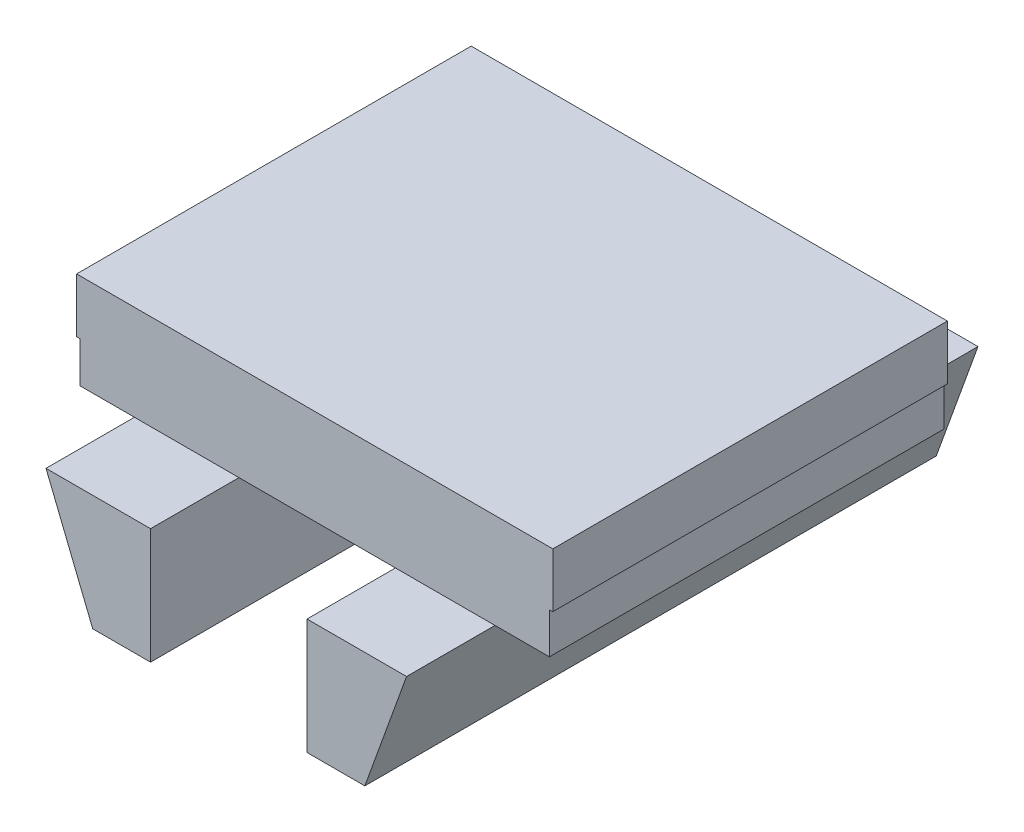
ISO-10303-21;
HEADER;
FILE_DESCRIPTION(('STEP AP214'),'2;1');
FILE_NAME('part.step','',(''),(''),'','','');
FILE_SCHEMA(('AUTOMOTIVE_DESIGN { 1 0 10303 214 1 1 1 1 }'));
ENDSEC;
DATA;
#1=APPLICATION_CONTEXT('core data for automotive mechanical design processes');
#2=APPLICATION_PROTOCOL_DEFINITION('international standard','automotive_design',2000,#1);
#3=PRODUCT_CONTEXT('',#1,'mechanical');
#4=PRODUCT('Part','Part','',(#3));
#5=PRODUCT_RELATED_PRODUCT_CATEGORY('part','',(#4));
#6=PRODUCT_DEFINITION_FORMATION('','',#4);
#7=PRODUCT_DEFINITION_CONTEXT('part definition',#1,'design');
#8=PRODUCT_DEFINITION('design','',#6,#7);
#9=PRODUCT_DEFINITION_SHAPE('','',#8);
#10=(LENGTH_UNIT() NAMED_UNIT(*) SI_UNIT(.MILLI.,.METRE.));
#11=(NAMED_UNIT(*) PLANE_ANGLE_UNIT() SI_UNIT($,.RADIAN.));
#12=(NAMED_UNIT(*) SI_UNIT($,.STERADIAN.) SOLID_ANGLE_UNIT());
#13=UNCERTAINTY_MEASURE_WITH_UNIT(LENGTH_MEASURE(1.E-05),#10,'distance_accuracy_value','');
#14=(GEOMETRIC_REPRESENTATION_CONTEXT(3) GLOBAL_UNCERTAINTY_ASSIGNED_CONTEXT((#13)) GLOBAL_UNIT_ASSIGNED_CONTEXT((#10,
#11,#12)) REPRESENTATION_CONTEXT('',''));
#15=CARTESIAN_POINT('',(0.,0.,0.));
#16=DIRECTION('',(0.,0.,1.));
#17=DIRECTION('',(1.,0.,0.));
#18=AXIS2_PLACEMENT_3D('',#15,#16,#17);
#19=CARTESIAN_POINT('',(-9.64285714285713,-4.85714285714286,-13.));
#20=DIRECTION('',(0.,1.,0.));
#21=DIRECTION('',(0.,0.,1.));
#22=AXIS2_PLACEMENT_3D('',#19,#20,#21);
#23=PLANE('',#22);
#24=DIRECTION('',(0.,0.,1.));
#25=VECTOR('',#24,1.);
#26=CARTESIAN_POINT('',(5.72394297103002,-4.85714285714286,-13.001));
#27=LINE('',#26,#25);
#28=CARTESIAN_POINT('',(5.72394297103002,-4.85714285714286,-13.));
#29=VERTEX_POINT('',#28);
#30=CARTESIAN_POINT('',(5.72394297103002,-4.85714285714286,0.));
#31=VERTEX_POINT('',#30);
#32=EDGE_CURVE('E193',#29,#31,#27,.T.);
#33=ORIENTED_EDGE('',*,*,#32,.F.);
#34=DIRECTION('',(-1.,0.,0.));
#35=VECTOR('',#34,1.);
#36=CARTESIAN_POINT('',(-9.64285714285713,-4.85714285714286,-13.));
#37=LINE('',#36,#35);
#38=CARTESIAN_POINT('',(-9.64285714285713,-4.85714285714286,-13.));
#39=VERTEX_POINT('',#38);
#40=EDGE_CURVE('E202',#29,#39,#37,.T.);
#41=ORIENTED_EDGE('',*,*,#40,.T.);
#42=DIRECTION('',(0.,0.,1.));
#43=VECTOR('',#42,1.);
#44=CARTESIAN_POINT('',(-9.64285714285713,-4.85714285714286,-13.));
#45=LINE('',#44,#43);
#46=CARTESIAN_POINT('',(-9.64285714285713,-4.85714285714286,0.));
#47=VERTEX_POINT('',#46);
#48=EDGE_CURVE('E50',#39,#47,#45,.T.);
#49=ORIENTED_EDGE('',*,*,#48,.T.);
#50=DIRECTION('',(1.,0.,0.));
#51=VECTOR('',#50,1.);
#52=CARTESIAN_POINT('',(-17.6428571428571,-4.85714285714286,0.));
#53=LINE('',#52,#51);
#54=EDGE_CURVE('E238',#47,#31,#53,.T.);
#55=ORIENTED_EDGE('',*,*,#54,.T.);
#56=EDGE_LOOP('',(#33,#41,#49,#55));
#57=FACE_BOUND('',#56,.T.);
#58=ADVANCED_FACE('F39',(#57),#23,.T.);
#59=CARTESIAN_POINT('',(5.72394297103002,-4.85714285714286,58.));
#60=VERTEX_POINT('',#59);
#61=CARTESIAN_POINT('',(5.72394297103002,-4.85714285714286,71.));
#62=VERTEX_POINT('',#61);
#63=EDGE_CURVE('E336',#60,#62,#27,.T.);
#64=ORIENTED_EDGE('',*,*,#63,.F.);
#65=DIRECTION('',(-1.,0.,0.));
#66=VECTOR('',#65,1.);
#67=CARTESIAN_POINT('',(-17.6428571428571,-4.85714285714286,58.));
#68=LINE('',#67,#66);
#69=CARTESIAN_POINT('',(-9.64285714285713,-4.85714285714286,58.));
#70=VERTEX_POINT('',#69);
#71=EDGE_CURVE('E66',#60,#70,#68,.T.);
#72=ORIENTED_EDGE('',*,*,#71,.T.);
#73=CARTESIAN_POINT('',(-9.64285714285713,-4.85714285714286,71.));
#74=VERTEX_POINT('',#73);
#75=EDGE_CURVE('E51',#70,#74,#45,.T.);
#76=ORIENTED_EDGE('',*,*,#75,.T.);
#77=DIRECTION('',(-1.,0.,0.));
#78=VECTOR('',#77,1.);
#79=CARTESIAN_POINT('',(-9.64285714285713,-4.85714285714286,71.));
#80=LINE('',#79,#78);
#81=EDGE_CURVE('E314',#62,#74,#80,.T.);
#82=ORIENTED_EDGE('',*,*,#81,.F.);
#83=EDGE_LOOP('',(#64,#72,#76,#82));
#84=FACE_BOUND('',#83,.T.);
#85=ADVANCED_FACE('F379',(#84),#23,.T.);
#86=CARTESIAN_POINT('',(37.22394297103,-21.8530695440626,-13.));
#87=DIRECTION('',(0.,-1.,0.));
#88=DIRECTION('',(0.,0.,-1.));
#89=AXIS2_PLACEMENT_3D('',#86,#87,#88);
#90=PLANE('',#89);
#91=DIRECTION('',(0.,0.,1.));
#92=VECTOR('',#91,1.);
#93=CARTESIAN_POINT('',(5.72394297103002,-21.8530695440626,-13.001));
#94=LINE('',#93,#92);
#95=CARTESIAN_POINT('',(5.72394297103002,-21.8530695440626,-13.));
#96=VERTEX_POINT('',#95);
#97=CARTESIAN_POINT('',(5.72394297103002,-21.8530695440626,71.));
#98=VERTEX_POINT('',#97);
#99=EDGE_CURVE('E180',#96,#98,#94,.T.);
#100=ORIENTED_EDGE('',*,*,#99,.T.);
#101=DIRECTION('',(1.,0.,0.));
#102=VECTOR('',#101,1.);
#103=CARTESIAN_POINT('',(37.22394297103,-21.8530695440626,71.));
#104=LINE('',#103,#102);
#105=CARTESIAN_POINT('',(-2.77605702896998,-21.8530695440626,71.));
#106=VERTEX_POINT('',#105);
#107=EDGE_CURVE('E315',#106,#98,#104,.T.);
#108=ORIENTED_EDGE('',*,*,#107,.F.);
#109=DIRECTION('',(0.,0.,1.));
#110=VECTOR('',#109,1.);
#111=CARTESIAN_POINT('',(-2.77605702896998,-21.8530695440626,-13.));
#112=LINE('',#111,#110);
#113=CARTESIAN_POINT('',(-2.77605702896998,-21.8530695440626,-13.));
#114=VERTEX_POINT('',#113);
#115=EDGE_CURVE('E206',#114,#106,#112,.T.);
#116=ORIENTED_EDGE('',*,*,#115,.F.);
#117=DIRECTION('',(1.,0.,0.));
#118=VECTOR('',#117,1.);
#119=CARTESIAN_POINT('',(37.22394297103,-21.8530695440626,-13.));
#120=LINE('',#119,#118);
#121=EDGE_CURVE('E200',#114,#96,#120,.T.);
#122=ORIENTED_EDGE('',*,*,#121,.T.);
#123=EDGE_LOOP('',(#100,#108,#116,#122));
#124=FACE_BOUND('',#123,.T.);
#125=ADVANCED_FACE('F205',(#124),#90,.T.);
#126=CARTESIAN_POINT('',(0.,0.,-13.));
#127=DIRECTION('',(0.,0.,-1.));
#128=DIRECTION('',(-1.,0.,0.));
#129=AXIS2_PLACEMENT_3D('',#126,#127,#128);
#130=PLANE('',#129);
#131=DIRECTION('',(0.,-1.,0.));
#132=VECTOR('',#131,1.);
#133=CARTESIAN_POINT('',(5.72394297103002,-21.8530695440626,-13.));
#134=LINE('',#133,#132);
#135=EDGE_CURVE('E184',#29,#96,#134,.T.);
#136=ORIENTED_EDGE('',*,*,#135,.T.);
#137=ORIENTED_EDGE('',*,*,#121,.F.);
#138=DIRECTION('',(0.37460659341591,-0.927183854566788,0.));
#139=VECTOR('',#138,1.);
#140=CARTESIAN_POINT('',(-2.77605702896998,-21.8530695440626,-13.));
#141=LINE('',#140,#139);
#142=EDGE_CURVE('E212',#39,#114,#141,.T.);
#143=ORIENTED_EDGE('',*,*,#142,.F.);
#144=ORIENTED_EDGE('',*,*,#40,.F.);
#145=EDGE_LOOP('',(#136,#137,#143,#144));
#146=FACE_BOUND('',#145,.T.);
#147=ADVANCED_FACE('F198',(#146),#130,.T.);
#148=CARTESIAN_POINT('',(0.,0.,71.));
#149=DIRECTION('',(0.,0.,-1.));
#150=DIRECTION('',(-1.,0.,0.));
#151=AXIS2_PLACEMENT_3D('',#148,#149,#150);
#152=PLANE('',#151);
#153=ORIENTED_EDGE('',*,*,#107,.T.);
#154=DIRECTION('',(0.,-1.,0.));
#155=VECTOR('',#154,1.);
#156=CARTESIAN_POINT('',(5.72394297103002,-21.8530695440626,71.));
#157=LINE('',#156,#155);
#158=EDGE_CURVE('E187',#62,#98,#157,.T.);
#159=ORIENTED_EDGE('',*,*,#158,.F.);
#160=ORIENTED_EDGE('',*,*,#81,.T.);
#161=DIRECTION('',(0.37460659341591,-0.927183854566788,0.));
#162=VECTOR('',#161,1.);
#163=CARTESIAN_POINT('',(-2.77605702896998,-21.8530695440626,71.));
#164=LINE('',#163,#162);
#165=EDGE_CURVE('E322',#74,#106,#164,.T.);
#166=ORIENTED_EDGE('',*,*,#165,.T.);
#167=EDGE_LOOP('',(#153,#159,#160,#166));
#168=FACE_BOUND('',#167,.T.);
#169=ADVANCED_FACE('F381',(#168),#152,.F.);
#170=CARTESIAN_POINT('',(0.,-4.85714285714286,0.));
#171=DIRECTION('',(0.,-1.,0.));
#172=DIRECTION('',(1.,0.,0.));
#173=AXIS2_PLACEMENT_3D('',#170,#171,#172);
#174=PLANE('',#173);
#175=CARTESIAN_POINT('',(-17.6428571428571,-4.85714285714286,0.));
#176=VERTEX_POINT('',#175);
#177=EDGE_CURVE('E234',#176,#47,#53,.T.);
#178=ORIENTED_EDGE('',*,*,#177,.T.);
#179=EDGE_CURVE('E11',#47,#70,#45,.T.);
#180=ORIENTED_EDGE('',*,*,#179,.T.);
#181=CARTESIAN_POINT('',(-17.6428571428571,-4.85714285714286,58.));
#182=VERTEX_POINT('',#181);
#183=EDGE_CURVE('E241',#70,#182,#68,.T.);
#184=ORIENTED_EDGE('',*,*,#183,.T.);
#185=DIRECTION('',(0.,0.,-1.));
#186=VECTOR('',#185,1.);
#187=CARTESIAN_POINT('',(-17.6428571428571,-4.85714285714286,58.));
#188=LINE('',#187,#186);
#189=EDGE_CURVE('E229',#182,#176,#188,.T.);
#190=ORIENTED_EDGE('',*,*,#189,.T.);
#191=EDGE_LOOP('',(#178,#180,#184,#190));
#192=FACE_BOUND('',#191,.T.);
#193=ADVANCED_FACE('F370',(#192),#174,.T.);
#194=CARTESIAN_POINT('',(-18.1428571428571,1.14285714285714,58.));
#195=DIRECTION('',(0.,1.,0.));
#196=DIRECTION('',(-1.,0.,0.));
#197=AXIS2_PLACEMENT_3D('',#194,#195,#196);
#198=PLANE('',#197);
#199=DIRECTION('',(0.,0.,-1.));
#200=VECTOR('',#199,1.);
#201=CARTESIAN_POINT('',(-17.6428571428571,1.14285714285714,58.));
#202=LINE('',#201,#200);
#203=CARTESIAN_POINT('',(-17.6428571428571,1.14285714285714,58.));
#204=VERTEX_POINT('',#203);
#205=CARTESIAN_POINT('',(-17.6428571428571,1.14285714285714,0.));
#206=VERTEX_POINT('',#205);
#207=EDGE_CURVE('E220',#204,#206,#202,.T.);
#208=ORIENTED_EDGE('',*,*,#207,.F.);
#209=DIRECTION('',(1.,0.,0.));
#210=VECTOR('',#209,1.);
#211=CARTESIAN_POINT('',(-18.1428571428571,1.14285714285714,58.));
#212=LINE('',#211,#210);
#213=CARTESIAN_POINT('',(-18.1428571428571,1.14285714285714,58.));
#214=VERTEX_POINT('',#213);
#215=EDGE_CURVE('E267',#214,#204,#212,.T.);
#216=ORIENTED_EDGE('',*,*,#215,.F.);
#217=DIRECTION('',(0.,0.,-1.));
#218=VECTOR('',#217,1.);
#219=CARTESIAN_POINT('',(-18.1428571428571,1.14285714285714,58.));
#220=LINE('',#219,#218);
#221=CARTESIAN_POINT('',(-18.1428571428571,1.14285714285714,0.));
#222=VERTEX_POINT('',#221);
#223=EDGE_CURVE('E43',#214,#222,#220,.T.);
#224=ORIENTED_EDGE('',*,*,#223,.T.);
#225=DIRECTION('',(1.,0.,0.));
#226=VECTOR('',#225,1.);
#227=CARTESIAN_POINT('',(-18.1428571428571,1.14285714285714,0.));
#228=LINE('',#227,#226);
#229=EDGE_CURVE('E278',#222,#206,#228,.T.);
#230=ORIENTED_EDGE('',*,*,#229,.T.);
#231=EDGE_LOOP('',(#208,#216,#224,#230));
#232=FACE_BOUND('',#231,.T.);
#233=ADVANCED_FACE('F388',(#232),#198,.F.);
#234=DIRECTION('',(0.,0.,1.));
#235=VECTOR('',#234,1.);
#236=CARTESIAN_POINT('',(51.3571428571429,1.14285714285714,58.));
#237=LINE('',#236,#235);
#238=CARTESIAN_POINT('',(51.3571428571429,1.14285714285714,0.));
#239=VERTEX_POINT('',#238);
#240=CARTESIAN_POINT('',(51.3571428571429,1.14285714285714,58.));
#241=VERTEX_POINT('',#240);
#242=EDGE_CURVE('E233',#239,#241,#237,.T.);
#243=ORIENTED_EDGE('',*,*,#242,.F.);
#244=CARTESIAN_POINT('',(51.8571428571429,1.14285714285714,0.));
#245=VERTEX_POINT('',#244);
#246=EDGE_CURVE('E277',#239,#245,#228,.T.);
#247=ORIENTED_EDGE('',*,*,#246,.T.);
#248=DIRECTION('',(0.,0.,-1.));
#249=VECTOR('',#248,1.);
#250=CARTESIAN_POINT('',(51.8571428571429,1.14285714285714,58.));
#251=LINE('',#250,#249);
#252=CARTESIAN_POINT('',(51.8571428571429,1.14285714285714,58.));
#253=VERTEX_POINT('',#252);
#254=EDGE_CURVE('E287',#253,#245,#251,.T.);
#255=ORIENTED_EDGE('',*,*,#254,.F.);
#256=EDGE_CURVE('E265',#241,#253,#212,.T.);
#257=ORIENTED_EDGE('',*,*,#256,.F.);
#258=EDGE_LOOP('',(#243,#247,#255,#257));
#259=FACE_BOUND('',#258,.T.);
#260=ADVANCED_FACE('F435',(#259),#198,.F.);
#261=CARTESIAN_POINT('',(-18.1428571428571,9.14285714285714,58.));
#262=DIRECTION('',(1.,0.,0.));
#263=DIRECTION('',(0.,0.,-1.));
#264=AXIS2_PLACEMENT_3D('',#261,#262,#263);
#265=PLANE('',#264);
#266=DIRECTION('',(0.,-1.,0.));
#267=VECTOR('',#266,1.);
#268=CARTESIAN_POINT('',(-18.1428571428571,9.14285714285714,0.));
#269=LINE('',#268,#267);
#270=CARTESIAN_POINT('',(-18.1428571428571,9.14285714285714,0.));
#271=VERTEX_POINT('',#270);
#272=EDGE_CURVE('E261',#271,#222,#269,.T.);
#273=ORIENTED_EDGE('',*,*,#272,.T.);
#274=ORIENTED_EDGE('',*,*,#223,.F.);
#275=DIRECTION('',(0.,-1.,0.));
#276=VECTOR('',#275,1.);
#277=CARTESIAN_POINT('',(-18.1428571428571,9.14285714285714,58.));
#278=LINE('',#277,#276);
#279=CARTESIAN_POINT('',(-18.1428571428571,9.14285714285714,58.));
#280=VERTEX_POINT('',#279);
#281=EDGE_CURVE('E262',#280,#214,#278,.T.);
#282=ORIENTED_EDGE('',*,*,#281,.F.);
#283=DIRECTION('',(0.,0.,-1.));
#284=VECTOR('',#283,1.);
#285=CARTESIAN_POINT('',(-18.1428571428571,9.14285714285714,58.));
#286=LINE('',#285,#284);
#287=EDGE_CURVE('E274',#280,#271,#286,.T.);
#288=ORIENTED_EDGE('',*,*,#287,.T.);
#289=EDGE_LOOP('',(#273,#274,#282,#288));
#290=FACE_BOUND('',#289,.T.);
#291=ADVANCED_FACE('F41',(#290),#265,.F.);
#292=CARTESIAN_POINT('',(51.8571428571429,9.14285714285714,58.));
#293=DIRECTION('',(-1.,0.,0.));
#294=DIRECTION('',(0.,0.,1.));
#295=AXIS2_PLACEMENT_3D('',#292,#293,#294);
#296=PLANE('',#295);
#297=DIRECTION('',(0.,1.,0.));
#298=VECTOR('',#297,1.);
#299=CARTESIAN_POINT('',(51.8571428571429,9.14285714285714,0.));
#300=LINE('',#299,#298);
#301=CARTESIAN_POINT('',(51.8571428571429,9.14285714285714,0.));
#302=VERTEX_POINT('',#301);
#303=EDGE_CURVE('E280',#245,#302,#300,.T.);
#304=ORIENTED_EDGE('',*,*,#303,.T.);
#305=DIRECTION('',(0.,0.,-1.));
#306=VECTOR('',#305,1.);
#307=CARTESIAN_POINT('',(51.8571428571429,9.14285714285714,58.));
#308=LINE('',#307,#306);
#309=CARTESIAN_POINT('',(51.8571428571429,9.14285714285714,58.));
#310=VERTEX_POINT('',#309);
#311=EDGE_CURVE('E285',#310,#302,#308,.T.);
#312=ORIENTED_EDGE('',*,*,#311,.F.);
#313=DIRECTION('',(0.,1.,0.));
#314=VECTOR('',#313,1.);
#315=CARTESIAN_POINT('',(51.8571428571429,9.14285714285714,58.));
#316=LINE('',#315,#314);
#317=EDGE_CURVE('E270',#253,#310,#316,.T.);
#318=ORIENTED_EDGE('',*,*,#317,.F.);
#319=ORIENTED_EDGE('',*,*,#254,.T.);
#320=EDGE_LOOP('',(#304,#312,#318,#319));
#321=FACE_BOUND('',#320,.T.);
#322=ADVANCED_FACE('F431',(#321),#296,.F.);
#323=CARTESIAN_POINT('',(-18.1428571428571,9.14285714285714,58.));
#324=DIRECTION('',(0.,-1.,0.));
#325=DIRECTION('',(0.,0.,-1.));
#326=AXIS2_PLACEMENT_3D('',#323,#324,#325);
#327=PLANE('',#326);
#328=DIRECTION('',(-1.,0.,0.));
#329=VECTOR('',#328,1.);
#330=CARTESIAN_POINT('',(-18.1428571428571,9.14285714285714,0.));
#331=LINE('',#330,#329);
#332=EDGE_CURVE('E266',#302,#271,#331,.T.);
#333=ORIENTED_EDGE('',*,*,#332,.T.);
#334=ORIENTED_EDGE('',*,*,#287,.F.);
#335=DIRECTION('',(-1.,0.,0.));
#336=VECTOR('',#335,1.);
#337=CARTESIAN_POINT('',(-18.1428571428571,9.14285714285714,58.));
#338=LINE('',#337,#336);
#339=EDGE_CURVE('E272',#310,#280,#338,.T.);
#340=ORIENTED_EDGE('',*,*,#339,.F.);
#341=ORIENTED_EDGE('',*,*,#311,.T.);
#342=EDGE_LOOP('',(#333,#334,#340,#341));
#343=FACE_BOUND('',#342,.T.);
#344=ADVANCED_FACE('F425',(#343),#327,.F.);
#345=CARTESIAN_POINT('',(0.,0.,58.));
#346=DIRECTION('',(0.,0.,1.));
#347=DIRECTION('',(1.,0.,0.));
#348=AXIS2_PLACEMENT_3D('',#345,#346,#347);
#349=PLANE('',#348);
#350=ORIENTED_EDGE('',*,*,#281,.T.);
#351=ORIENTED_EDGE('',*,*,#215,.T.);
#352=DIRECTION('',(0.,1.,0.));
#353=VECTOR('',#352,1.);
#354=CARTESIAN_POINT('',(-17.6428571428571,-4.85714285714286,58.));
#355=LINE('',#354,#353);
#356=EDGE_CURVE('E244',#182,#204,#355,.T.);
#357=ORIENTED_EDGE('',*,*,#356,.F.);
#358=ORIENTED_EDGE('',*,*,#183,.F.);
#359=ORIENTED_EDGE('',*,*,#71,.F.);
#360=DIRECTION('',(-1.,0.,0.));
#361=VECTOR('',#360,1.);
#362=CARTESIAN_POINT('',(0.,-4.85714285714286,58.));
#363=LINE('',#362,#361);
#364=CARTESIAN_POINT('',(28.72394297103,-4.85714285714286,58.));
#365=VERTEX_POINT('',#364);
#366=EDGE_CURVE('E325',#365,#60,#363,.T.);
#367=ORIENTED_EDGE('',*,*,#366,.F.);
#368=CARTESIAN_POINT('',(43.3571428571429,-4.85714285714286,58.));
#369=VERTEX_POINT('',#368);
#370=EDGE_CURVE('E245',#369,#365,#68,.T.);
#371=ORIENTED_EDGE('',*,*,#370,.F.);
#372=CARTESIAN_POINT('',(51.3571428571429,-4.85714285714286,58.));
#373=VERTEX_POINT('',#372);
#374=EDGE_CURVE('E242',#373,#369,#68,.T.);
#375=ORIENTED_EDGE('',*,*,#374,.F.);
#376=DIRECTION('',(0.,1.,0.));
#377=VECTOR('',#376,1.);
#378=CARTESIAN_POINT('',(51.3571428571429,-4.85714285714286,58.));
#379=LINE('',#378,#377);
#380=EDGE_CURVE('E252',#373,#241,#379,.T.);
#381=ORIENTED_EDGE('',*,*,#380,.T.);
#382=ORIENTED_EDGE('',*,*,#256,.T.);
#383=ORIENTED_EDGE('',*,*,#317,.T.);
#384=ORIENTED_EDGE('',*,*,#339,.T.);
#385=EDGE_LOOP('',(#350,#351,#357,#358,#359,#367,#371,#375,#381,#382,#383,#384));
#386=FACE_BOUND('',#385,.T.);
#387=ADVANCED_FACE('F422',(#386),#349,.T.);
#388=CARTESIAN_POINT('',(0.,0.,0.));
#389=DIRECTION('',(0.,0.,1.));
#390=DIRECTION('',(1.,0.,0.));
#391=AXIS2_PLACEMENT_3D('',#388,#389,#390);
#392=PLANE('',#391);
#393=ORIENTED_EDGE('',*,*,#272,.F.);
#394=ORIENTED_EDGE('',*,*,#332,.F.);
#395=ORIENTED_EDGE('',*,*,#303,.F.);
#396=ORIENTED_EDGE('',*,*,#246,.F.);
#397=DIRECTION('',(0.,1.,0.));
#398=VECTOR('',#397,1.);
#399=CARTESIAN_POINT('',(51.3571428571429,-4.85714285714286,0.));
#400=LINE('',#399,#398);
#401=CARTESIAN_POINT('',(51.3571428571429,-4.85714285714286,0.));
#402=VERTEX_POINT('',#401);
#403=EDGE_CURVE('E255',#402,#239,#400,.T.);
#404=ORIENTED_EDGE('',*,*,#403,.F.);
#405=CARTESIAN_POINT('',(43.3571428571429,-4.85714285714286,0.));
#406=VERTEX_POINT('',#405);
#407=EDGE_CURVE('E232',#406,#402,#53,.T.);
#408=ORIENTED_EDGE('',*,*,#407,.F.);
#409=CARTESIAN_POINT('',(28.72394297103,-4.85714285714286,0.));
#410=VERTEX_POINT('',#409);
#411=EDGE_CURVE('E239',#410,#406,#53,.T.);
#412=ORIENTED_EDGE('',*,*,#411,.F.);
#413=DIRECTION('',(-1.,0.,0.));
#414=VECTOR('',#413,1.);
#415=CARTESIAN_POINT('',(0.,-4.85714285714286,0.));
#416=LINE('',#415,#414);
#417=EDGE_CURVE('E327',#410,#31,#416,.T.);
#418=ORIENTED_EDGE('',*,*,#417,.T.);
#419=ORIENTED_EDGE('',*,*,#54,.F.);
#420=ORIENTED_EDGE('',*,*,#177,.F.);
#421=DIRECTION('',(0.,1.,0.));
#422=VECTOR('',#421,1.);
#423=CARTESIAN_POINT('',(-17.6428571428571,-4.85714285714286,0.));
#424=LINE('',#423,#422);
#425=EDGE_CURVE('E258',#176,#206,#424,.T.);
#426=ORIENTED_EDGE('',*,*,#425,.T.);
#427=ORIENTED_EDGE('',*,*,#229,.F.);
#428=EDGE_LOOP('',(#393,#394,#395,#396,#404,#408,#412,#418,#419,#420,#426,#427));
#429=FACE_BOUND('',#428,.T.);
#430=ADVANCED_FACE('F362',(#429),#392,.F.);
#431=CARTESIAN_POINT('',(-17.6428571428571,-4.85714285714286,58.));
#432=DIRECTION('',(1.,0.,0.));
#433=DIRECTION('',(0.,0.,-1.));
#434=AXIS2_PLACEMENT_3D('',#431,#432,#433);
#435=PLANE('',#434);
#436=ORIENTED_EDGE('',*,*,#207,.T.);
#437=ORIENTED_EDGE('',*,*,#425,.F.);
#438=ORIENTED_EDGE('',*,*,#189,.F.);
#439=ORIENTED_EDGE('',*,*,#356,.T.);
#440=EDGE_LOOP('',(#436,#437,#438,#439));
#441=FACE_BOUND('',#440,.T.);
#442=ADVANCED_FACE('F414',(#441),#435,.F.);
#443=CARTESIAN_POINT('',(51.3571428571429,-4.85714285714286,58.));
#444=DIRECTION('',(-1.,0.,0.));
#445=DIRECTION('',(0.,0.,1.));
#446=AXIS2_PLACEMENT_3D('',#443,#444,#445);
#447=PLANE('',#446);
#448=ORIENTED_EDGE('',*,*,#242,.T.);
#449=ORIENTED_EDGE('',*,*,#380,.F.);
#450=DIRECTION('',(0.,0.,1.));
#451=VECTOR('',#450,1.);
#452=CARTESIAN_POINT('',(51.3571428571429,-4.85714285714286,58.));
#453=LINE('',#452,#451);
#454=EDGE_CURVE('E237',#402,#373,#453,.T.);
#455=ORIENTED_EDGE('',*,*,#454,.F.);
#456=ORIENTED_EDGE('',*,*,#403,.T.);
#457=EDGE_LOOP('',(#448,#449,#455,#456));
#458=FACE_BOUND('',#457,.T.);
#459=ADVANCED_FACE('F410',(#458),#447,.F.);
#460=DIRECTION('',(0.,0.,1.));
#461=VECTOR('',#460,1.);
#462=CARTESIAN_POINT('',(43.3571428571429,-4.85714285714286,-13.));
#463=LINE('',#462,#461);
#464=EDGE_CURVE('E48',#406,#369,#463,.T.);
#465=ORIENTED_EDGE('',*,*,#464,.F.);
#466=ORIENTED_EDGE('',*,*,#407,.T.);
#467=ORIENTED_EDGE('',*,*,#454,.T.);
#468=ORIENTED_EDGE('',*,*,#374,.T.);
#469=EDGE_LOOP('',(#465,#466,#467,#468));
#470=FACE_BOUND('',#469,.T.);
#471=ADVANCED_FACE('F357',(#470),#174,.T.);
#472=DIRECTION('',(0.,0.,1.));
#473=VECTOR('',#472,1.);
#474=CARTESIAN_POINT('',(28.72394297103,-4.85714285714286,-13.001));
#475=LINE('',#474,#473);
#476=CARTESIAN_POINT('',(28.72394297103,-4.85714285714286,-13.));
#477=VERTEX_POINT('',#476);
#478=EDGE_CURVE('E333',#477,#410,#475,.T.);
#479=ORIENTED_EDGE('',*,*,#478,.T.);
#480=ORIENTED_EDGE('',*,*,#411,.T.);
#481=CARTESIAN_POINT('',(43.3571428571429,-4.85714285714286,-13.));
#482=VERTEX_POINT('',#481);
#483=EDGE_CURVE('E221',#482,#406,#463,.T.);
#484=ORIENTED_EDGE('',*,*,#483,.F.);
#485=EDGE_CURVE('E216',#482,#477,#37,.T.);
#486=ORIENTED_EDGE('',*,*,#485,.T.);
#487=EDGE_LOOP('',(#479,#480,#484,#486));
#488=FACE_BOUND('',#487,.T.);
#489=ADVANCED_FACE('F352',(#488),#23,.T.);
#490=CARTESIAN_POINT('',(-2.77605702896998,-21.8530695440626,-13.));
#491=DIRECTION('',(-0.927183854566788,-0.37460659341591,0.));
#492=DIRECTION('',(0.37460659341591,-0.927183854566788,0.));
#493=AXIS2_PLACEMENT_3D('',#490,#491,#492);
#494=PLANE('',#493);
#495=ORIENTED_EDGE('',*,*,#115,.T.);
#496=ORIENTED_EDGE('',*,*,#165,.F.);
#497=ORIENTED_EDGE('',*,*,#75,.F.);
#498=ORIENTED_EDGE('',*,*,#179,.F.);
#499=ORIENTED_EDGE('',*,*,#48,.F.);
#500=ORIENTED_EDGE('',*,*,#142,.T.);
#501=EDGE_LOOP('',(#495,#496,#497,#498,#499,#500));
#502=FACE_BOUND('',#501,.T.);
#503=ADVANCED_FACE('F376',(#502),#494,.T.);
#504=CARTESIAN_POINT('',(28.72394297103,-4.85714285714286,71.));
#505=VERTEX_POINT('',#504);
#506=EDGE_CURVE('E319',#365,#505,#475,.T.);
#507=ORIENTED_EDGE('',*,*,#506,.T.);
#508=CARTESIAN_POINT('',(43.3571428571429,-4.85714285714286,71.));
#509=VERTEX_POINT('',#508);
#510=EDGE_CURVE('E311',#509,#505,#80,.T.);
#511=ORIENTED_EDGE('',*,*,#510,.F.);
#512=EDGE_CURVE('E224',#369,#509,#463,.T.);
#513=ORIENTED_EDGE('',*,*,#512,.F.);
#514=ORIENTED_EDGE('',*,*,#370,.T.);
#515=EDGE_LOOP('',(#507,#511,#513,#514));
#516=FACE_BOUND('',#515,.T.);
#517=ADVANCED_FACE('F318',(#516),#23,.T.);
#518=CARTESIAN_POINT('',(43.3571428571429,-4.85714285714286,-13.));
#519=DIRECTION('',(0.94062845261506,-0.33943793855578,0.));
#520=DIRECTION('',(0.33943793855578,0.94062845261506,0.));
#521=AXIS2_PLACEMENT_3D('',#518,#519,#520);
#522=PLANE('',#521);
#523=ORIENTED_EDGE('',*,*,#483,.T.);
#524=ORIENTED_EDGE('',*,*,#464,.T.);
#525=ORIENTED_EDGE('',*,*,#512,.T.);
#526=DIRECTION('',(0.33943793855578,0.94062845261506,0.));
#527=VECTOR('',#526,1.);
#528=CARTESIAN_POINT('',(43.3571428571429,-4.85714285714286,71.));
#529=LINE('',#528,#527);
#530=CARTESIAN_POINT('',(37.22394297103,-21.8530695440626,71.));
#531=VERTEX_POINT('',#530);
#532=EDGE_CURVE('E304',#531,#509,#529,.T.);
#533=ORIENTED_EDGE('',*,*,#532,.F.);
#534=DIRECTION('',(0.,0.,1.));
#535=VECTOR('',#534,1.);
#536=CARTESIAN_POINT('',(37.22394297103,-21.8530695440626,-13.));
#537=LINE('',#536,#535);
#538=CARTESIAN_POINT('',(37.22394297103,-21.8530695440626,-13.));
#539=VERTEX_POINT('',#538);
#540=EDGE_CURVE('E225',#539,#531,#537,.T.);
#541=ORIENTED_EDGE('',*,*,#540,.F.);
#542=DIRECTION('',(0.33943793855578,0.94062845261506,0.));
#543=VECTOR('',#542,1.);
#544=CARTESIAN_POINT('',(43.3571428571429,-4.85714285714286,-13.));
#545=LINE('',#544,#543);
#546=EDGE_CURVE('E207',#539,#482,#545,.T.);
#547=ORIENTED_EDGE('',*,*,#546,.T.);
#548=EDGE_LOOP('',(#523,#524,#525,#533,#541,#547));
#549=FACE_BOUND('',#548,.T.);
#550=ADVANCED_FACE('F302',(#549),#522,.T.);
#551=DIRECTION('',(0.,0.,1.));
#552=VECTOR('',#551,1.);
#553=CARTESIAN_POINT('',(28.72394297103,-21.8530695440626,-13.001));
#554=LINE('',#553,#552);
#555=CARTESIAN_POINT('',(28.72394297103,-21.8530695440626,-13.));
#556=VERTEX_POINT('',#555);
#557=CARTESIAN_POINT('',(28.72394297103,-21.8530695440626,71.));
#558=VERTEX_POINT('',#557);
#559=EDGE_CURVE('E58',#556,#558,#554,.T.);
#560=ORIENTED_EDGE('',*,*,#559,.F.);
#561=EDGE_CURVE('E208',#556,#539,#120,.T.);
#562=ORIENTED_EDGE('',*,*,#561,.T.);
#563=ORIENTED_EDGE('',*,*,#540,.T.);
#564=EDGE_CURVE('E313',#558,#531,#104,.T.);
#565=ORIENTED_EDGE('',*,*,#564,.F.);
#566=EDGE_LOOP('',(#560,#562,#563,#565));
#567=FACE_BOUND('',#566,.T.);
#568=ADVANCED_FACE('F345',(#567),#90,.T.);
#569=DIRECTION('',(0.,1.,0.));
#570=VECTOR('',#569,1.);
#571=CARTESIAN_POINT('',(28.72394297103,-4.85714285714286,-13.));
#572=LINE('',#571,#570);
#573=EDGE_CURVE('E192',#556,#477,#572,.T.);
#574=ORIENTED_EDGE('',*,*,#573,.T.);
#575=ORIENTED_EDGE('',*,*,#485,.F.);
#576=ORIENTED_EDGE('',*,*,#546,.F.);
#577=ORIENTED_EDGE('',*,*,#561,.F.);
#578=EDGE_LOOP('',(#574,#575,#576,#577));
#579=FACE_BOUND('',#578,.T.);
#580=ADVANCED_FACE('F350',(#579),#130,.T.);
#581=ORIENTED_EDGE('',*,*,#510,.T.);
#582=DIRECTION('',(0.,1.,0.));
#583=VECTOR('',#582,1.);
#584=CARTESIAN_POINT('',(28.72394297103,-4.85714285714286,71.));
#585=LINE('',#584,#583);
#586=EDGE_CURVE('E203',#558,#505,#585,.T.);
#587=ORIENTED_EDGE('',*,*,#586,.F.);
#588=ORIENTED_EDGE('',*,*,#564,.T.);
#589=ORIENTED_EDGE('',*,*,#532,.T.);
#590=EDGE_LOOP('',(#581,#587,#588,#589));
#591=FACE_BOUND('',#590,.T.);
#592=ADVANCED_FACE('F310',(#591),#152,.F.);
#593=CARTESIAN_POINT('',(5.72394297103002,-4.85714285714286,-13.001));
#594=DIRECTION('',(0.,1.,0.));
#595=DIRECTION('',(-1.,0.,0.));
#596=AXIS2_PLACEMENT_3D('',#593,#594,#595);
#597=PLANE('',#596);
#598=ORIENTED_EDGE('',*,*,#366,.T.);
#599=EDGE_CURVE('E338',#31,#60,#27,.T.);
#600=ORIENTED_EDGE('',*,*,#599,.F.);
#601=ORIENTED_EDGE('',*,*,#417,.F.);
#602=EDGE_CURVE('E337',#410,#365,#475,.T.);
#603=ORIENTED_EDGE('',*,*,#602,.T.);
#604=EDGE_LOOP('',(#598,#600,#601,#603));
#605=FACE_BOUND('',#604,.T.);
#606=ADVANCED_FACE('F393',(#605),#597,.F.);
#607=CARTESIAN_POINT('',(5.72394297103002,-21.8530695440626,-13.001));
#608=DIRECTION('',(-1.,0.,0.));
#609=DIRECTION('',(0.,0.,1.));
#610=AXIS2_PLACEMENT_3D('',#607,#608,#609);
#611=PLANE('',#610);
#612=ORIENTED_EDGE('',*,*,#32,.T.);
#613=ORIENTED_EDGE('',*,*,#599,.T.);
#614=ORIENTED_EDGE('',*,*,#63,.T.);
#615=ORIENTED_EDGE('',*,*,#158,.T.);
#616=ORIENTED_EDGE('',*,*,#99,.F.);
#617=ORIENTED_EDGE('',*,*,#135,.F.);
#618=EDGE_LOOP('',(#612,#613,#614,#615,#616,#617));
#619=FACE_BOUND('',#618,.T.);
#620=ADVANCED_FACE('F183',(#619),#611,.F.);
#621=CARTESIAN_POINT('',(28.72394297103,-4.85714285714286,-13.001));
#622=DIRECTION('',(1.,0.,0.));
#623=DIRECTION('',(0.,0.,-1.));
#624=AXIS2_PLACEMENT_3D('',#621,#622,#623);
#625=PLANE('',#624);
#626=ORIENTED_EDGE('',*,*,#559,.T.);
#627=ORIENTED_EDGE('',*,*,#586,.T.);
#628=ORIENTED_EDGE('',*,*,#506,.F.);
#629=ORIENTED_EDGE('',*,*,#602,.F.);
#630=ORIENTED_EDGE('',*,*,#478,.F.);
#631=ORIENTED_EDGE('',*,*,#573,.F.);
#632=EDGE_LOOP('',(#626,#627,#628,#629,#630,#631));
#633=FACE_BOUND('',#632,.T.);
#634=ADVANCED_FACE('F341',(#633),#625,.F.);
#635=CLOSED_SHELL('',(#58,#85,#125,#147,#169,#193,#233,#260,#291,#322,#344,#387,#430,#442,#459,
#471,#489,#503,#517,#550,#568,#580,#592,#606,#620,#634));
#636=MANIFOLD_SOLID_BREP('B2',#635);
#637=ADVANCED_BREP_SHAPE_REPRESENTATION('',(#18,#636),#14);
#638=SHAPE_DEFINITION_REPRESENTATION(#9,#637);
ENDSEC;
END-ISO-10303-21;
